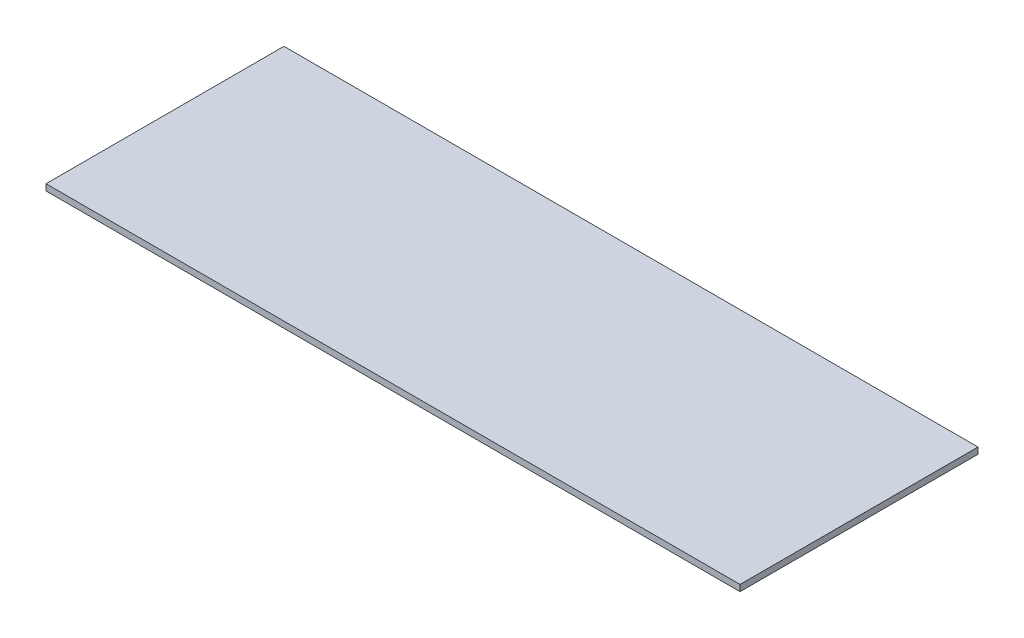
ISO-10303-21;
HEADER;
FILE_DESCRIPTION(('STEP AP214'),'2;1');
FILE_NAME('part.step','',(''),(''),'','','');
FILE_SCHEMA(('AUTOMOTIVE_DESIGN { 1 0 10303 214 1 1 1 1 }'));
ENDSEC;
DATA;
#1=APPLICATION_CONTEXT('core data for automotive mechanical design processes');
#2=APPLICATION_PROTOCOL_DEFINITION('international standard','automotive_design',2000,#1);
#3=PRODUCT_CONTEXT('',#1,'mechanical');
#4=PRODUCT('Part','Part','',(#3));
#5=PRODUCT_RELATED_PRODUCT_CATEGORY('part','',(#4));
#6=PRODUCT_DEFINITION_FORMATION('','',#4);
#7=PRODUCT_DEFINITION_CONTEXT('part definition',#1,'design');
#8=PRODUCT_DEFINITION('design','',#6,#7);
#9=PRODUCT_DEFINITION_SHAPE('','',#8);
#10=(LENGTH_UNIT() NAMED_UNIT(*) SI_UNIT(.MILLI.,.METRE.));
#11=(NAMED_UNIT(*) PLANE_ANGLE_UNIT() SI_UNIT($,.RADIAN.));
#12=(NAMED_UNIT(*) SI_UNIT($,.STERADIAN.) SOLID_ANGLE_UNIT());
#13=UNCERTAINTY_MEASURE_WITH_UNIT(LENGTH_MEASURE(1.E-05),#10,'distance_accuracy_value','');
#14=(GEOMETRIC_REPRESENTATION_CONTEXT(3) GLOBAL_UNCERTAINTY_ASSIGNED_CONTEXT((#13)) GLOBAL_UNIT_ASSIGNED_CONTEXT((#10,
#11,#12)) REPRESENTATION_CONTEXT('',''));
#15=CARTESIAN_POINT('',(0.,0.,0.));
#16=DIRECTION('',(0.,0.,1.));
#17=DIRECTION('',(1.,0.,0.));
#18=AXIS2_PLACEMENT_3D('',#15,#16,#17);
#19=CARTESIAN_POINT('',(0.,12.7,0.));
#20=DIRECTION('',(1.,0.,0.));
#21=DIRECTION('',(0.,0.,-1.));
#22=AXIS2_PLACEMENT_3D('',#19,#20,#21);
#23=PLANE('',#22);
#24=DIRECTION('',(0.,0.,1.));
#25=VECTOR('',#24,1.);
#26=CARTESIAN_POINT('',(0.,0.,0.));
#27=LINE('',#26,#25);
#28=CARTESIAN_POINT('',(0.,0.,-480.));
#29=VERTEX_POINT('',#28);
#30=CARTESIAN_POINT('',(0.,0.,0.));
#31=VERTEX_POINT('',#30);
#32=EDGE_CURVE('E95',#29,#31,#27,.T.);
#33=ORIENTED_EDGE('',*,*,#32,.T.);
#34=DIRECTION('',(0.,-1.,0.));
#35=VECTOR('',#34,1.);
#36=CARTESIAN_POINT('',(0.,12.7,0.));
#37=LINE('',#36,#35);
#38=CARTESIAN_POINT('',(0.,12.7,0.));
#39=VERTEX_POINT('',#38);
#40=EDGE_CURVE('E11',#39,#31,#37,.T.);
#41=ORIENTED_EDGE('',*,*,#40,.F.);
#42=DIRECTION('',(0.,0.,1.));
#43=VECTOR('',#42,1.);
#44=CARTESIAN_POINT('',(0.,12.7,0.));
#45=LINE('',#44,#43);
#46=CARTESIAN_POINT('',(0.,12.7,-480.));
#47=VERTEX_POINT('',#46);
#48=EDGE_CURVE('E83',#47,#39,#45,.T.);
#49=ORIENTED_EDGE('',*,*,#48,.F.);
#50=DIRECTION('',(0.,-1.,0.));
#51=VECTOR('',#50,1.);
#52=CARTESIAN_POINT('',(0.,12.7,-480.));
#53=LINE('',#52,#51);
#54=EDGE_CURVE('E91',#47,#29,#53,.T.);
#55=ORIENTED_EDGE('',*,*,#54,.T.);
#56=EDGE_LOOP('',(#33,#41,#49,#55));
#57=FACE_BOUND('',#56,.T.);
#58=ADVANCED_FACE('F32',(#57),#23,.F.);
#59=CARTESIAN_POINT('',(0.,12.7,0.));
#60=DIRECTION('',(0.,0.,-1.));
#61=DIRECTION('',(-1.,0.,0.));
#62=AXIS2_PLACEMENT_3D('',#59,#60,#61);
#63=PLANE('',#62);
#64=DIRECTION('',(1.,0.,0.));
#65=VECTOR('',#64,1.);
#66=CARTESIAN_POINT('',(0.,0.,0.));
#67=LINE('',#66,#65);
#68=CARTESIAN_POINT('',(1400.,0.,0.));
#69=VERTEX_POINT('',#68);
#70=EDGE_CURVE('E87',#31,#69,#67,.T.);
#71=ORIENTED_EDGE('',*,*,#70,.T.);
#72=DIRECTION('',(0.,-1.,0.));
#73=VECTOR('',#72,1.);
#74=CARTESIAN_POINT('',(1400.,12.7,0.));
#75=LINE('',#74,#73);
#76=CARTESIAN_POINT('',(1400.,12.7,0.));
#77=VERTEX_POINT('',#76);
#78=EDGE_CURVE('E40',#77,#69,#75,.T.);
#79=ORIENTED_EDGE('',*,*,#78,.F.);
#80=DIRECTION('',(1.,0.,0.));
#81=VECTOR('',#80,1.);
#82=CARTESIAN_POINT('',(0.,12.7,0.));
#83=LINE('',#82,#81);
#84=EDGE_CURVE('E78',#39,#77,#83,.T.);
#85=ORIENTED_EDGE('',*,*,#84,.F.);
#86=ORIENTED_EDGE('',*,*,#40,.T.);
#87=EDGE_LOOP('',(#71,#79,#85,#86));
#88=FACE_BOUND('',#87,.T.);
#89=ADVANCED_FACE('F86',(#88),#63,.F.);
#90=CARTESIAN_POINT('',(1400.,12.7,0.));
#91=DIRECTION('',(-1.,0.,0.));
#92=DIRECTION('',(0.,0.,1.));
#93=AXIS2_PLACEMENT_3D('',#90,#91,#92);
#94=PLANE('',#93);
#95=DIRECTION('',(0.,0.,-1.));
#96=VECTOR('',#95,1.);
#97=CARTESIAN_POINT('',(1400.,0.,0.));
#98=LINE('',#97,#96);
#99=CARTESIAN_POINT('',(1400.,0.,-480.));
#100=VERTEX_POINT('',#99);
#101=EDGE_CURVE('E65',#69,#100,#98,.T.);
#102=ORIENTED_EDGE('',*,*,#101,.T.);
#103=DIRECTION('',(0.,-1.,0.));
#104=VECTOR('',#103,1.);
#105=CARTESIAN_POINT('',(1400.,12.7,-480.));
#106=LINE('',#105,#104);
#107=CARTESIAN_POINT('',(1400.,12.7,-480.));
#108=VERTEX_POINT('',#107);
#109=EDGE_CURVE('E88',#108,#100,#106,.T.);
#110=ORIENTED_EDGE('',*,*,#109,.F.);
#111=DIRECTION('',(0.,0.,-1.));
#112=VECTOR('',#111,1.);
#113=CARTESIAN_POINT('',(1400.,12.7,0.));
#114=LINE('',#113,#112);
#115=EDGE_CURVE('E81',#77,#108,#114,.T.);
#116=ORIENTED_EDGE('',*,*,#115,.F.);
#117=ORIENTED_EDGE('',*,*,#78,.T.);
#118=EDGE_LOOP('',(#102,#110,#116,#117));
#119=FACE_BOUND('',#118,.T.);
#120=ADVANCED_FACE('F89',(#119),#94,.F.);
#121=CARTESIAN_POINT('',(0.,12.7,-480.));
#122=DIRECTION('',(0.,0.,1.));
#123=DIRECTION('',(1.,0.,0.));
#124=AXIS2_PLACEMENT_3D('',#121,#122,#123);
#125=PLANE('',#124);
#126=DIRECTION('',(-1.,0.,0.));
#127=VECTOR('',#126,1.);
#128=CARTESIAN_POINT('',(0.,0.,-480.));
#129=LINE('',#128,#127);
#130=EDGE_CURVE('E71',#100,#29,#129,.T.);
#131=ORIENTED_EDGE('',*,*,#130,.T.);
#132=ORIENTED_EDGE('',*,*,#54,.F.);
#133=DIRECTION('',(-1.,0.,0.));
#134=VECTOR('',#133,1.);
#135=CARTESIAN_POINT('',(0.,12.7,-480.));
#136=LINE('',#135,#134);
#137=EDGE_CURVE('E48',#108,#47,#136,.T.);
#138=ORIENTED_EDGE('',*,*,#137,.F.);
#139=ORIENTED_EDGE('',*,*,#109,.T.);
#140=EDGE_LOOP('',(#131,#132,#138,#139));
#141=FACE_BOUND('',#140,.T.);
#142=ADVANCED_FACE('F102',(#141),#125,.F.);
#143=CARTESIAN_POINT('',(0.,12.7,0.));
#144=DIRECTION('',(0.,-1.,0.));
#145=DIRECTION('',(0.,0.,-1.));
#146=AXIS2_PLACEMENT_3D('',#143,#144,#145);
#147=PLANE('',#146);
#148=ORIENTED_EDGE('',*,*,#48,.T.);
#149=ORIENTED_EDGE('',*,*,#84,.T.);
#150=ORIENTED_EDGE('',*,*,#115,.T.);
#151=ORIENTED_EDGE('',*,*,#137,.T.);
#152=EDGE_LOOP('',(#148,#149,#150,#151));
#153=FACE_BOUND('',#152,.T.);
#154=ADVANCED_FACE('F79',(#153),#147,.F.);
#155=CARTESIAN_POINT('',(0.,0.,0.));
#156=DIRECTION('',(0.,-1.,0.));
#157=DIRECTION('',(0.,0.,-1.));
#158=AXIS2_PLACEMENT_3D('',#155,#156,#157);
#159=PLANE('',#158);
#160=ORIENTED_EDGE('',*,*,#32,.F.);
#161=ORIENTED_EDGE('',*,*,#130,.F.);
#162=ORIENTED_EDGE('',*,*,#101,.F.);
#163=ORIENTED_EDGE('',*,*,#70,.F.);
#164=EDGE_LOOP('',(#160,#161,#162,#163));
#165=FACE_BOUND('',#164,.T.);
#166=ADVANCED_FACE('F105',(#165),#159,.T.);
#167=CLOSED_SHELL('',(#58,#89,#120,#142,#154,#166));
#168=MANIFOLD_SOLID_BREP('B2',#167);
#169=ADVANCED_BREP_SHAPE_REPRESENTATION('',(#18,#168),#14);
#170=SHAPE_DEFINITION_REPRESENTATION(#9,#169);
ENDSEC;
END-ISO-10303-21;
